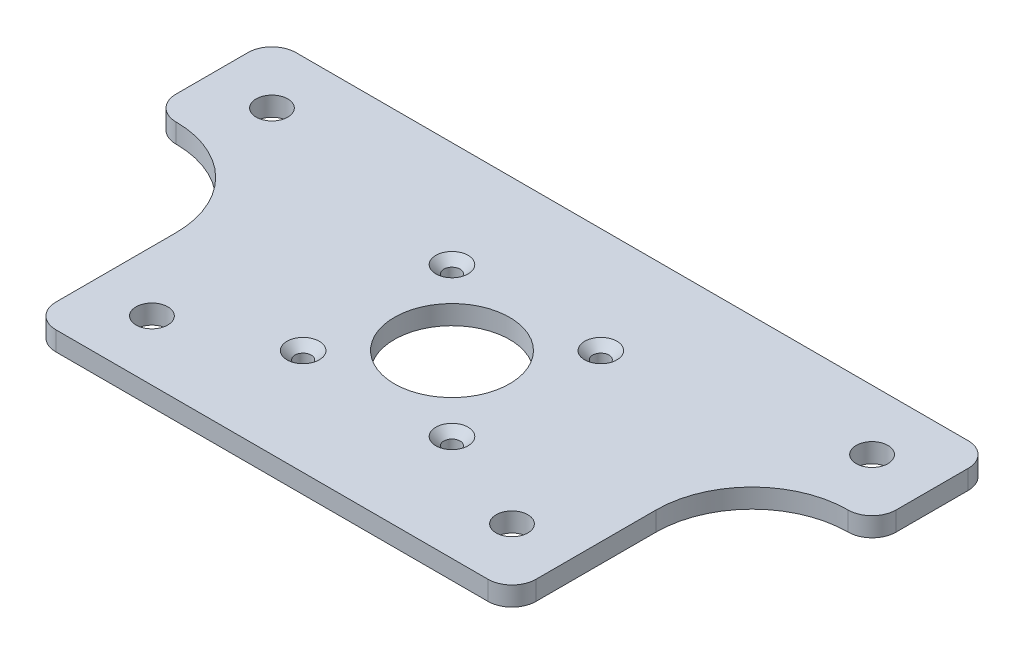
ISO-10303-21;
HEADER;
FILE_DESCRIPTION(('STEP AP214'),'2;1');
FILE_NAME('part.step','',(''),(''),'','','');
FILE_SCHEMA(('AUTOMOTIVE_DESIGN { 1 0 10303 214 1 1 1 1 }'));
ENDSEC;
DATA;
#1=APPLICATION_CONTEXT('core data for automotive mechanical design processes');
#2=APPLICATION_PROTOCOL_DEFINITION('international standard','automotive_design',2000,#1);
#3=PRODUCT_CONTEXT('',#1,'mechanical');
#4=PRODUCT('Part','Part','',(#3));
#5=PRODUCT_RELATED_PRODUCT_CATEGORY('part','',(#4));
#6=PRODUCT_DEFINITION_FORMATION('','',#4);
#7=PRODUCT_DEFINITION_CONTEXT('part definition',#1,'design');
#8=PRODUCT_DEFINITION('design','',#6,#7);
#9=PRODUCT_DEFINITION_SHAPE('','',#8);
#10=(LENGTH_UNIT() NAMED_UNIT(*) SI_UNIT(.MILLI.,.METRE.));
#11=(NAMED_UNIT(*) PLANE_ANGLE_UNIT() SI_UNIT($,.RADIAN.));
#12=(NAMED_UNIT(*) SI_UNIT($,.STERADIAN.) SOLID_ANGLE_UNIT());
#13=UNCERTAINTY_MEASURE_WITH_UNIT(LENGTH_MEASURE(1.E-05),#10,'distance_accuracy_value','');
#14=(GEOMETRIC_REPRESENTATION_CONTEXT(3) GLOBAL_UNCERTAINTY_ASSIGNED_CONTEXT((#13)) GLOBAL_UNIT_ASSIGNED_CONTEXT((#10,
#11,#12)) REPRESENTATION_CONTEXT('',''));
#15=CARTESIAN_POINT('',(0.,0.,0.));
#16=DIRECTION('',(0.,0.,1.));
#17=DIRECTION('',(1.,0.,0.));
#18=AXIS2_PLACEMENT_3D('',#15,#16,#17);
#19=CARTESIAN_POINT('',(0.,4.,-37.5));
#20=DIRECTION('',(0.,0.,1.));
#21=DIRECTION('',(1.,0.,0.));
#22=AXIS2_PLACEMENT_3D('',#19,#20,#21);
#23=PLANE('',#22);
#24=DIRECTION('',(-1.,0.,0.));
#25=VECTOR('',#24,1.);
#26=CARTESIAN_POINT('',(0.,4.,-37.5));
#27=LINE('',#26,#25);
#28=CARTESIAN_POINT('',(70.,4.,-37.5));
#29=VERTEX_POINT('',#28);
#30=CARTESIAN_POINT('',(-70.,4.,-37.5));
#31=VERTEX_POINT('',#30);
#32=EDGE_CURVE('E156',#29,#31,#27,.T.);
#33=ORIENTED_EDGE('',*,*,#32,.F.);
#34=DIRECTION('',(0.,-1.,0.));
#35=VECTOR('',#34,1.);
#36=CARTESIAN_POINT('',(70.,0.,-37.5));
#37=LINE('',#36,#35);
#38=CARTESIAN_POINT('',(70.,0.,-37.5));
#39=VERTEX_POINT('',#38);
#40=EDGE_CURVE('E141',#29,#39,#37,.T.);
#41=ORIENTED_EDGE('',*,*,#40,.T.);
#42=DIRECTION('',(-1.,0.,0.));
#43=VECTOR('',#42,1.);
#44=CARTESIAN_POINT('',(0.,0.,-37.5));
#45=LINE('',#44,#43);
#46=CARTESIAN_POINT('',(-70.,0.,-37.5));
#47=VERTEX_POINT('',#46);
#48=EDGE_CURVE('E153',#39,#47,#45,.T.);
#49=ORIENTED_EDGE('',*,*,#48,.T.);
#50=DIRECTION('',(0.,-1.,0.));
#51=VECTOR('',#50,1.);
#52=CARTESIAN_POINT('',(-70.,4.,-37.5));
#53=LINE('',#52,#51);
#54=EDGE_CURVE('E158',#47,#31,#53,.F.);
#55=ORIENTED_EDGE('',*,*,#54,.T.);
#56=EDGE_LOOP('',(#33,#41,#49,#55));
#57=FACE_BOUND('',#56,.T.);
#58=ADVANCED_FACE('F38',(#57),#23,.F.);
#59=CARTESIAN_POINT('',(-75.,4.,0.));
#60=DIRECTION('',(1.,0.,0.));
#61=DIRECTION('',(0.,0.,-1.));
#62=AXIS2_PLACEMENT_3D('',#59,#60,#61);
#63=PLANE('',#62);
#64=DIRECTION('',(0.,0.,1.));
#65=VECTOR('',#64,1.);
#66=CARTESIAN_POINT('',(-75.,0.,0.));
#67=LINE('',#66,#65);
#68=CARTESIAN_POINT('',(-75.,0.,-32.5));
#69=VERTEX_POINT('',#68);
#70=CARTESIAN_POINT('',(-75.,0.,-17.5));
#71=VERTEX_POINT('',#70);
#72=EDGE_CURVE('E163',#69,#71,#67,.T.);
#73=ORIENTED_EDGE('',*,*,#72,.T.);
#74=DIRECTION('',(0.,-1.,0.));
#75=VECTOR('',#74,1.);
#76=CARTESIAN_POINT('',(-75.,4.,-17.5));
#77=LINE('',#76,#75);
#78=CARTESIAN_POINT('',(-75.,4.,-17.5));
#79=VERTEX_POINT('',#78);
#80=EDGE_CURVE('E233',#71,#79,#77,.F.);
#81=ORIENTED_EDGE('',*,*,#80,.T.);
#82=DIRECTION('',(0.,0.,1.));
#83=VECTOR('',#82,1.);
#84=CARTESIAN_POINT('',(-75.,4.,0.));
#85=LINE('',#84,#83);
#86=CARTESIAN_POINT('',(-75.,4.,-32.5));
#87=VERTEX_POINT('',#86);
#88=EDGE_CURVE('E255',#87,#79,#85,.T.);
#89=ORIENTED_EDGE('',*,*,#88,.F.);
#90=DIRECTION('',(0.,-1.,0.));
#91=VECTOR('',#90,1.);
#92=CARTESIAN_POINT('',(-75.,4.,-32.5));
#93=LINE('',#92,#91);
#94=EDGE_CURVE('E230',#87,#69,#93,.T.);
#95=ORIENTED_EDGE('',*,*,#94,.T.);
#96=EDGE_LOOP('',(#73,#81,#89,#95));
#97=FACE_BOUND('',#96,.T.);
#98=ADVANCED_FACE('F293',(#97),#63,.F.);
#99=CARTESIAN_POINT('',(-50.,4.,0.));
#100=DIRECTION('',(1.,0.,0.));
#101=DIRECTION('',(0.,0.,-1.));
#102=AXIS2_PLACEMENT_3D('',#99,#100,#101);
#103=PLANE('',#102);
#104=DIRECTION('',(0.,0.,1.));
#105=VECTOR('',#104,1.);
#106=CARTESIAN_POINT('',(-50.,4.,0.));
#107=LINE('',#106,#105);
#108=CARTESIAN_POINT('',(-50.,4.,7.49999999999999));
#109=VERTEX_POINT('',#108);
#110=CARTESIAN_POINT('',(-50.,4.,32.5));
#111=VERTEX_POINT('',#110);
#112=EDGE_CURVE('E251',#109,#111,#107,.T.);
#113=ORIENTED_EDGE('',*,*,#112,.F.);
#114=DIRECTION('',(0.,-1.,0.));
#115=VECTOR('',#114,1.);
#116=CARTESIAN_POINT('',(-50.,4.,7.49999999999999));
#117=LINE('',#116,#115);
#118=CARTESIAN_POINT('',(-50.,0.,7.49999999999999));
#119=VERTEX_POINT('',#118);
#120=EDGE_CURVE('E237',#109,#119,#117,.T.);
#121=ORIENTED_EDGE('',*,*,#120,.T.);
#122=DIRECTION('',(0.,0.,1.));
#123=VECTOR('',#122,1.);
#124=CARTESIAN_POINT('',(-50.,0.,0.));
#125=LINE('',#124,#123);
#126=CARTESIAN_POINT('',(-50.,0.,32.5));
#127=VERTEX_POINT('',#126);
#128=EDGE_CURVE('E167',#119,#127,#125,.T.);
#129=ORIENTED_EDGE('',*,*,#128,.T.);
#130=DIRECTION('',(0.,-1.,0.));
#131=VECTOR('',#130,1.);
#132=CARTESIAN_POINT('',(-50.,4.,32.5));
#133=LINE('',#132,#131);
#134=EDGE_CURVE('E225',#127,#111,#133,.F.);
#135=ORIENTED_EDGE('',*,*,#134,.T.);
#136=EDGE_LOOP('',(#113,#121,#129,#135));
#137=FACE_BOUND('',#136,.T.);
#138=ADVANCED_FACE('F250',(#137),#103,.F.);
#139=CARTESIAN_POINT('',(0.,4.,37.5));
#140=DIRECTION('',(0.,0.,1.));
#141=DIRECTION('',(1.,0.,0.));
#142=AXIS2_PLACEMENT_3D('',#139,#140,#141);
#143=PLANE('',#142);
#144=DIRECTION('',(-1.,0.,0.));
#145=VECTOR('',#144,1.);
#146=CARTESIAN_POINT('',(0.,0.,37.5));
#147=LINE('',#146,#145);
#148=CARTESIAN_POINT('',(45.,0.,37.5));
#149=VERTEX_POINT('',#148);
#150=CARTESIAN_POINT('',(-45.,0.,37.5));
#151=VERTEX_POINT('',#150);
#152=EDGE_CURVE('E177',#149,#151,#147,.T.);
#153=ORIENTED_EDGE('',*,*,#152,.F.);
#154=DIRECTION('',(0.,-1.,0.));
#155=VECTOR('',#154,1.);
#156=CARTESIAN_POINT('',(45.,4.,37.5));
#157=LINE('',#156,#155);
#158=CARTESIAN_POINT('',(45.,4.,37.5));
#159=VERTEX_POINT('',#158);
#160=EDGE_CURVE('E223',#149,#159,#157,.F.);
#161=ORIENTED_EDGE('',*,*,#160,.T.);
#162=DIRECTION('',(-1.,0.,0.));
#163=VECTOR('',#162,1.);
#164=CARTESIAN_POINT('',(0.,4.,37.5));
#165=LINE('',#164,#163);
#166=CARTESIAN_POINT('',(-45.,4.,37.5));
#167=VERTEX_POINT('',#166);
#168=EDGE_CURVE('E254',#159,#167,#165,.T.);
#169=ORIENTED_EDGE('',*,*,#168,.T.);
#170=DIRECTION('',(0.,-1.,0.));
#171=VECTOR('',#170,1.);
#172=CARTESIAN_POINT('',(-45.,0.,37.5));
#173=LINE('',#172,#171);
#174=EDGE_CURVE('E220',#167,#151,#173,.T.);
#175=ORIENTED_EDGE('',*,*,#174,.T.);
#176=EDGE_LOOP('',(#153,#161,#169,#175));
#177=FACE_BOUND('',#176,.T.);
#178=ADVANCED_FACE('F341',(#177),#143,.T.);
#179=CARTESIAN_POINT('',(50.,4.,0.));
#180=DIRECTION('',(-1.,0.,0.));
#181=DIRECTION('',(0.,0.,1.));
#182=AXIS2_PLACEMENT_3D('',#179,#180,#181);
#183=PLANE('',#182);
#184=DIRECTION('',(0.,0.,-1.));
#185=VECTOR('',#184,1.);
#186=CARTESIAN_POINT('',(50.,0.,0.));
#187=LINE('',#186,#185);
#188=CARTESIAN_POINT('',(50.,0.,32.5));
#189=VERTEX_POINT('',#188);
#190=CARTESIAN_POINT('',(50.,0.,7.50000000000001));
#191=VERTEX_POINT('',#190);
#192=EDGE_CURVE('E180',#189,#191,#187,.T.);
#193=ORIENTED_EDGE('',*,*,#192,.T.);
#194=DIRECTION('',(0.,-1.,0.));
#195=VECTOR('',#194,1.);
#196=CARTESIAN_POINT('',(50.,4.,7.50000000000001));
#197=LINE('',#196,#195);
#198=CARTESIAN_POINT('',(50.,4.,7.50000000000001));
#199=VERTEX_POINT('',#198);
#200=EDGE_CURVE('E235',#191,#199,#197,.F.);
#201=ORIENTED_EDGE('',*,*,#200,.T.);
#202=DIRECTION('',(0.,0.,-1.));
#203=VECTOR('',#202,1.);
#204=CARTESIAN_POINT('',(50.,4.,0.));
#205=LINE('',#204,#203);
#206=CARTESIAN_POINT('',(50.,4.,32.5));
#207=VERTEX_POINT('',#206);
#208=EDGE_CURVE('E258',#207,#199,#205,.T.);
#209=ORIENTED_EDGE('',*,*,#208,.F.);
#210=DIRECTION('',(0.,-1.,0.));
#211=VECTOR('',#210,1.);
#212=CARTESIAN_POINT('',(50.,0.,32.5));
#213=LINE('',#212,#211);
#214=EDGE_CURVE('E217',#207,#189,#213,.T.);
#215=ORIENTED_EDGE('',*,*,#214,.T.);
#216=EDGE_LOOP('',(#193,#201,#209,#215));
#217=FACE_BOUND('',#216,.T.);
#218=ADVANCED_FACE('F335',(#217),#183,.F.);
#219=CARTESIAN_POINT('',(75.,4.,0.));
#220=DIRECTION('',(1.,0.,0.));
#221=DIRECTION('',(0.,0.,-1.));
#222=AXIS2_PLACEMENT_3D('',#219,#220,#221);
#223=PLANE('',#222);
#224=DIRECTION('',(0.,0.,1.));
#225=VECTOR('',#224,1.);
#226=CARTESIAN_POINT('',(75.,0.,0.));
#227=LINE('',#226,#225);
#228=CARTESIAN_POINT('',(75.,0.,-32.5));
#229=VERTEX_POINT('',#228);
#230=CARTESIAN_POINT('',(75.,0.,-17.5));
#231=VERTEX_POINT('',#230);
#232=EDGE_CURVE('E183',#229,#231,#227,.T.);
#233=ORIENTED_EDGE('',*,*,#232,.F.);
#234=DIRECTION('',(0.,-1.,0.));
#235=VECTOR('',#234,1.);
#236=CARTESIAN_POINT('',(75.,4.,-32.5));
#237=LINE('',#236,#235);
#238=CARTESIAN_POINT('',(75.,4.,-32.5));
#239=VERTEX_POINT('',#238);
#240=EDGE_CURVE('E142',#229,#239,#237,.F.);
#241=ORIENTED_EDGE('',*,*,#240,.T.);
#242=DIRECTION('',(0.,0.,1.));
#243=VECTOR('',#242,1.);
#244=CARTESIAN_POINT('',(75.,4.,0.));
#245=LINE('',#244,#243);
#246=CARTESIAN_POINT('',(75.,4.,-17.5));
#247=VERTEX_POINT('',#246);
#248=EDGE_CURVE('E265',#239,#247,#245,.T.);
#249=ORIENTED_EDGE('',*,*,#248,.T.);
#250=DIRECTION('',(0.,-1.,0.));
#251=VECTOR('',#250,1.);
#252=CARTESIAN_POINT('',(75.,0.,-17.5));
#253=LINE('',#252,#251);
#254=EDGE_CURVE('E147',#247,#231,#253,.T.);
#255=ORIENTED_EDGE('',*,*,#254,.T.);
#256=EDGE_LOOP('',(#233,#241,#249,#255));
#257=FACE_BOUND('',#256,.T.);
#258=ADVANCED_FACE('F287',(#257),#223,.T.);
#259=CARTESIAN_POINT('',(0.,4.,0.));
#260=DIRECTION('',(0.,-1.,0.));
#261=DIRECTION('',(0.,0.,-1.));
#262=AXIS2_PLACEMENT_3D('',#259,#260,#261);
#263=CYLINDRICAL_SURFACE('',#262,12.);
#264=CARTESIAN_POINT('',(0.,4.,0.));
#265=DIRECTION('',(0.,1.,0.));
#266=DIRECTION('',(0.,0.,1.));
#267=AXIS2_PLACEMENT_3D('',#264,#265,#266);
#268=CIRCLE('',#267,12.);
#269=CARTESIAN_POINT('',(0.,4.,12.));
#270=VERTEX_POINT('',#269);
#271=EDGE_CURVE('E173',#270,#270,#268,.T.);
#272=ORIENTED_EDGE('',*,*,#271,.T.);
#273=EDGE_LOOP('',(#272));
#274=FACE_BOUND('',#273,.T.);
#275=CARTESIAN_POINT('',(0.,0.,0.));
#276=DIRECTION('',(0.,1.,0.));
#277=DIRECTION('',(0.,0.,1.));
#278=AXIS2_PLACEMENT_3D('',#275,#276,#277);
#279=CIRCLE('',#278,12.);
#280=CARTESIAN_POINT('',(0.,0.,12.));
#281=VERTEX_POINT('',#280);
#282=EDGE_CURVE('E185',#281,#281,#279,.T.);
#283=ORIENTED_EDGE('',*,*,#282,.F.);
#284=EDGE_LOOP('',(#283));
#285=FACE_BOUND('',#284,.T.);
#286=ADVANCED_FACE('F273',(#274,#285),#263,.F.);
#287=CARTESIAN_POINT('',(0.,4.,0.));
#288=DIRECTION('',(0.,1.,0.));
#289=DIRECTION('',(0.,0.,1.));
#290=AXIS2_PLACEMENT_3D('',#287,#288,#289);
#291=PLANE('',#290);
#292=CARTESIAN_POINT('',(-62.5,4.,-25.));
#293=DIRECTION('',(0.,1.,0.));
#294=DIRECTION('',(0.,0.,1.));
#295=AXIS2_PLACEMENT_3D('',#292,#293,#294);
#296=CIRCLE('',#295,3.29999999999999);
#297=CARTESIAN_POINT('',(-62.5,4.,-21.7));
#298=VERTEX_POINT('',#297);
#299=EDGE_CURVE('E593',#298,#298,#296,.T.);
#300=ORIENTED_EDGE('',*,*,#299,.F.);
#301=EDGE_LOOP('',(#300));
#302=FACE_BOUND('',#301,.T.);
#303=CARTESIAN_POINT('',(-37.5,4.,25.));
#304=DIRECTION('',(0.,1.,0.));
#305=DIRECTION('',(0.,0.,1.));
#306=AXIS2_PLACEMENT_3D('',#303,#304,#305);
#307=CIRCLE('',#306,3.29999999999999);
#308=CARTESIAN_POINT('',(-37.5,4.,28.3));
#309=VERTEX_POINT('',#308);
#310=EDGE_CURVE('E597',#309,#309,#307,.T.);
#311=ORIENTED_EDGE('',*,*,#310,.F.);
#312=EDGE_LOOP('',(#311));
#313=FACE_BOUND('',#312,.T.);
#314=CARTESIAN_POINT('',(37.5,4.,25.));
#315=DIRECTION('',(0.,1.,0.));
#316=DIRECTION('',(0.,0.,1.));
#317=AXIS2_PLACEMENT_3D('',#314,#315,#316);
#318=CIRCLE('',#317,3.29999999999999);
#319=CARTESIAN_POINT('',(37.5,4.,28.3));
#320=VERTEX_POINT('',#319);
#321=EDGE_CURVE('E606',#320,#320,#318,.T.);
#322=ORIENTED_EDGE('',*,*,#321,.F.);
#323=EDGE_LOOP('',(#322));
#324=FACE_BOUND('',#323,.T.);
#325=CARTESIAN_POINT('',(62.5,4.,-25.));
#326=DIRECTION('',(0.,1.,0.));
#327=DIRECTION('',(0.,0.,1.));
#328=AXIS2_PLACEMENT_3D('',#325,#326,#327);
#329=CIRCLE('',#328,3.3);
#330=CARTESIAN_POINT('',(62.5,4.,-21.7));
#331=VERTEX_POINT('',#330);
#332=EDGE_CURVE('E612',#331,#331,#329,.T.);
#333=ORIENTED_EDGE('',*,*,#332,.F.);
#334=EDGE_LOOP('',(#333));
#335=FACE_BOUND('',#334,.T.);
#336=CARTESIAN_POINT('',(-15.5,4.,15.5));
#337=DIRECTION('',(0.,1.,0.));
#338=DIRECTION('',(0.,0.,1.));
#339=AXIS2_PLACEMENT_3D('',#336,#337,#338);
#340=CIRCLE('',#339,3.36);
#341=CARTESIAN_POINT('',(-15.5,4.,18.86));
#342=VERTEX_POINT('',#341);
#343=EDGE_CURVE('E615',#342,#342,#340,.T.);
#344=ORIENTED_EDGE('',*,*,#343,.F.);
#345=EDGE_LOOP('',(#344));
#346=FACE_BOUND('',#345,.T.);
#347=CARTESIAN_POINT('',(15.5,4.,15.5));
#348=DIRECTION('',(0.,1.,0.));
#349=DIRECTION('',(0.,0.,1.));
#350=AXIS2_PLACEMENT_3D('',#347,#348,#349);
#351=CIRCLE('',#350,3.36);
#352=CARTESIAN_POINT('',(15.5,4.,18.86));
#353=VERTEX_POINT('',#352);
#354=EDGE_CURVE('E624',#353,#353,#351,.T.);
#355=ORIENTED_EDGE('',*,*,#354,.F.);
#356=EDGE_LOOP('',(#355));
#357=FACE_BOUND('',#356,.T.);
#358=CARTESIAN_POINT('',(15.5,4.,-15.5));
#359=DIRECTION('',(0.,1.,0.));
#360=DIRECTION('',(0.,0.,1.));
#361=AXIS2_PLACEMENT_3D('',#358,#359,#360);
#362=CIRCLE('',#361,3.36);
#363=CARTESIAN_POINT('',(15.5,4.,-12.14));
#364=VERTEX_POINT('',#363);
#365=EDGE_CURVE('E633',#364,#364,#362,.T.);
#366=ORIENTED_EDGE('',*,*,#365,.F.);
#367=EDGE_LOOP('',(#366));
#368=FACE_BOUND('',#367,.T.);
#369=CARTESIAN_POINT('',(-15.5,4.,-15.5));
#370=DIRECTION('',(0.,1.,0.));
#371=DIRECTION('',(0.,0.,1.));
#372=AXIS2_PLACEMENT_3D('',#369,#370,#371);
#373=CIRCLE('',#372,3.36);
#374=CARTESIAN_POINT('',(-15.5,4.,-12.14));
#375=VERTEX_POINT('',#374);
#376=EDGE_CURVE('E642',#375,#375,#373,.T.);
#377=ORIENTED_EDGE('',*,*,#376,.F.);
#378=EDGE_LOOP('',(#377));
#379=FACE_BOUND('',#378,.T.);
#380=ORIENTED_EDGE('',*,*,#248,.F.);
#381=CARTESIAN_POINT('',(70.,4.,-32.5));
#382=DIRECTION('',(0.,1.,0.));
#383=DIRECTION('',(0.,0.,1.));
#384=AXIS2_PLACEMENT_3D('',#381,#382,#383);
#385=CIRCLE('',#384,5.);
#386=EDGE_CURVE('E212',#239,#29,#385,.T.);
#387=ORIENTED_EDGE('',*,*,#386,.T.);
#388=ORIENTED_EDGE('',*,*,#32,.T.);
#389=CARTESIAN_POINT('',(-70.,4.,-32.5));
#390=DIRECTION('',(0.,1.,0.));
#391=DIRECTION('',(0.,0.,1.));
#392=AXIS2_PLACEMENT_3D('',#389,#390,#391);
#393=CIRCLE('',#392,5.);
#394=EDGE_CURVE('E202',#31,#87,#393,.T.);
#395=ORIENTED_EDGE('',*,*,#394,.T.);
#396=ORIENTED_EDGE('',*,*,#88,.T.);
#397=CARTESIAN_POINT('',(-70.,4.,-17.5));
#398=DIRECTION('',(0.,1.,0.));
#399=DIRECTION('',(0.,0.,1.));
#400=AXIS2_PLACEMENT_3D('',#397,#398,#399);
#401=CIRCLE('',#400,5.);
#402=CARTESIAN_POINT('',(-70.,4.,-12.5));
#403=VERTEX_POINT('',#402);
#404=EDGE_CURVE('E204',#79,#403,#401,.T.);
#405=ORIENTED_EDGE('',*,*,#404,.T.);
#406=CARTESIAN_POINT('',(-70.,4.,7.49999999999999));
#407=DIRECTION('',(0.,1.,0.));
#408=DIRECTION('',(0.,0.,1.));
#409=AXIS2_PLACEMENT_3D('',#406,#407,#408);
#410=CIRCLE('',#409,20.);
#411=EDGE_CURVE('E11',#403,#109,#410,.F.);
#412=ORIENTED_EDGE('',*,*,#411,.T.);
#413=ORIENTED_EDGE('',*,*,#112,.T.);
#414=CARTESIAN_POINT('',(-45.,4.,32.5));
#415=DIRECTION('',(0.,1.,0.));
#416=DIRECTION('',(0.,0.,1.));
#417=AXIS2_PLACEMENT_3D('',#414,#415,#416);
#418=CIRCLE('',#417,5.);
#419=EDGE_CURVE('E206',#111,#167,#418,.T.);
#420=ORIENTED_EDGE('',*,*,#419,.T.);
#421=ORIENTED_EDGE('',*,*,#168,.F.);
#422=CARTESIAN_POINT('',(45.,4.,32.5));
#423=DIRECTION('',(0.,1.,0.));
#424=DIRECTION('',(0.,0.,1.));
#425=AXIS2_PLACEMENT_3D('',#422,#423,#424);
#426=CIRCLE('',#425,5.);
#427=EDGE_CURVE('E208',#159,#207,#426,.T.);
#428=ORIENTED_EDGE('',*,*,#427,.T.);
#429=ORIENTED_EDGE('',*,*,#208,.T.);
#430=CARTESIAN_POINT('',(70.,4.,7.50000000000001));
#431=DIRECTION('',(0.,1.,0.));
#432=DIRECTION('',(0.,0.,1.));
#433=AXIS2_PLACEMENT_3D('',#430,#431,#432);
#434=CIRCLE('',#433,20.);
#435=CARTESIAN_POINT('',(70.,4.,-12.5));
#436=VERTEX_POINT('',#435);
#437=EDGE_CURVE('E241',#199,#436,#434,.F.);
#438=ORIENTED_EDGE('',*,*,#437,.T.);
#439=CARTESIAN_POINT('',(70.,4.,-17.5));
#440=DIRECTION('',(0.,1.,0.));
#441=DIRECTION('',(0.,0.,1.));
#442=AXIS2_PLACEMENT_3D('',#439,#440,#441);
#443=CIRCLE('',#442,5.);
#444=EDGE_CURVE('E210',#436,#247,#443,.T.);
#445=ORIENTED_EDGE('',*,*,#444,.T.);
#446=EDGE_LOOP('',(#380,#387,#388,#395,#396,#405,#412,#413,#420,#421,#428,#429,#438,#445));
#447=FACE_BOUND('',#446,.T.);
#448=ORIENTED_EDGE('',*,*,#271,.F.);
#449=EDGE_LOOP('',(#448));
#450=FACE_BOUND('',#449,.T.);
#451=ADVANCED_FACE('F276',(#302,#313,#324,#335,#346,#357,#368,#379,#447,#450),#291,.T.);
#452=CARTESIAN_POINT('',(0.,0.,0.));
#453=DIRECTION('',(0.,1.,0.));
#454=DIRECTION('',(0.,0.,1.));
#455=AXIS2_PLACEMENT_3D('',#452,#453,#454);
#456=PLANE('',#455);
#457=CARTESIAN_POINT('',(-62.5,0.,-25.));
#458=DIRECTION('',(0.,-1.,0.));
#459=DIRECTION('',(0.,0.,-1.));
#460=AXIS2_PLACEMENT_3D('',#457,#458,#459);
#461=CIRCLE('',#460,3.29999999999998);
#462=CARTESIAN_POINT('',(-62.5,0.,-28.3));
#463=VERTEX_POINT('',#462);
#464=EDGE_CURVE('E591',#463,#463,#461,.T.);
#465=ORIENTED_EDGE('',*,*,#464,.F.);
#466=EDGE_LOOP('',(#465));
#467=FACE_BOUND('',#466,.T.);
#468=CARTESIAN_POINT('',(-37.5,0.,25.));
#469=DIRECTION('',(0.,-1.,0.));
#470=DIRECTION('',(0.,0.,-1.));
#471=AXIS2_PLACEMENT_3D('',#468,#469,#470);
#472=CIRCLE('',#471,3.29999999999998);
#473=CARTESIAN_POINT('',(-37.5,0.,21.7));
#474=VERTEX_POINT('',#473);
#475=EDGE_CURVE('E594',#474,#474,#472,.T.);
#476=ORIENTED_EDGE('',*,*,#475,.F.);
#477=EDGE_LOOP('',(#476));
#478=FACE_BOUND('',#477,.T.);
#479=CARTESIAN_POINT('',(37.5,0.,25.));
#480=DIRECTION('',(0.,-1.,0.));
#481=DIRECTION('',(0.,0.,-1.));
#482=AXIS2_PLACEMENT_3D('',#479,#480,#481);
#483=CIRCLE('',#482,3.29999999999998);
#484=CARTESIAN_POINT('',(37.5,0.,21.7));
#485=VERTEX_POINT('',#484);
#486=EDGE_CURVE('E603',#485,#485,#483,.T.);
#487=ORIENTED_EDGE('',*,*,#486,.F.);
#488=EDGE_LOOP('',(#487));
#489=FACE_BOUND('',#488,.T.);
#490=CARTESIAN_POINT('',(62.5,0.,-25.));
#491=DIRECTION('',(0.,-1.,0.));
#492=DIRECTION('',(0.,0.,-1.));
#493=AXIS2_PLACEMENT_3D('',#490,#491,#492);
#494=CIRCLE('',#493,3.29999999999999);
#495=CARTESIAN_POINT('',(62.5,0.,-28.3));
#496=VERTEX_POINT('',#495);
#497=EDGE_CURVE('E609',#496,#496,#494,.T.);
#498=ORIENTED_EDGE('',*,*,#497,.F.);
#499=EDGE_LOOP('',(#498));
#500=FACE_BOUND('',#499,.T.);
#501=CARTESIAN_POINT('',(-15.5,0.,15.5));
#502=DIRECTION('',(0.,1.,0.));
#503=DIRECTION('',(0.,0.,1.));
#504=AXIS2_PLACEMENT_3D('',#501,#502,#503);
#505=CIRCLE('',#504,1.7);
#506=CARTESIAN_POINT('',(-15.5,0.,17.2));
#507=VERTEX_POINT('',#506);
#508=EDGE_CURVE('E621',#507,#507,#505,.T.);
#509=ORIENTED_EDGE('',*,*,#508,.T.);
#510=EDGE_LOOP('',(#509));
#511=FACE_BOUND('',#510,.T.);
#512=CARTESIAN_POINT('',(15.5,0.,15.5));
#513=DIRECTION('',(0.,1.,0.));
#514=DIRECTION('',(0.,0.,1.));
#515=AXIS2_PLACEMENT_3D('',#512,#513,#514);
#516=CIRCLE('',#515,1.7);
#517=CARTESIAN_POINT('',(15.5,0.,17.2));
#518=VERTEX_POINT('',#517);
#519=EDGE_CURVE('E630',#518,#518,#516,.T.);
#520=ORIENTED_EDGE('',*,*,#519,.T.);
#521=EDGE_LOOP('',(#520));
#522=FACE_BOUND('',#521,.T.);
#523=CARTESIAN_POINT('',(15.5,0.,-15.5));
#524=DIRECTION('',(0.,1.,0.));
#525=DIRECTION('',(0.,0.,1.));
#526=AXIS2_PLACEMENT_3D('',#523,#524,#525);
#527=CIRCLE('',#526,1.7);
#528=CARTESIAN_POINT('',(15.5,0.,-13.8));
#529=VERTEX_POINT('',#528);
#530=EDGE_CURVE('E639',#529,#529,#527,.T.);
#531=ORIENTED_EDGE('',*,*,#530,.T.);
#532=EDGE_LOOP('',(#531));
#533=FACE_BOUND('',#532,.T.);
#534=CARTESIAN_POINT('',(-15.5,0.,-15.5));
#535=DIRECTION('',(0.,1.,0.));
#536=DIRECTION('',(0.,0.,1.));
#537=AXIS2_PLACEMENT_3D('',#534,#535,#536);
#538=CIRCLE('',#537,1.7);
#539=CARTESIAN_POINT('',(-15.5,0.,-13.8));
#540=VERTEX_POINT('',#539);
#541=EDGE_CURVE('E164',#540,#540,#538,.T.);
#542=ORIENTED_EDGE('',*,*,#541,.T.);
#543=EDGE_LOOP('',(#542));
#544=FACE_BOUND('',#543,.T.);
#545=ORIENTED_EDGE('',*,*,#48,.F.);
#546=CARTESIAN_POINT('',(70.,0.,-32.5));
#547=DIRECTION('',(0.,1.,0.));
#548=DIRECTION('',(0.,0.,1.));
#549=AXIS2_PLACEMENT_3D('',#546,#547,#548);
#550=CIRCLE('',#549,5.);
#551=EDGE_CURVE('E137',#39,#229,#550,.F.);
#552=ORIENTED_EDGE('',*,*,#551,.T.);
#553=ORIENTED_EDGE('',*,*,#232,.T.);
#554=CARTESIAN_POINT('',(70.,0.,-17.5));
#555=DIRECTION('',(0.,1.,0.));
#556=DIRECTION('',(0.,0.,1.));
#557=AXIS2_PLACEMENT_3D('',#554,#555,#556);
#558=CIRCLE('',#557,5.);
#559=CARTESIAN_POINT('',(70.,0.,-12.5));
#560=VERTEX_POINT('',#559);
#561=EDGE_CURVE('E148',#231,#560,#558,.F.);
#562=ORIENTED_EDGE('',*,*,#561,.T.);
#563=CARTESIAN_POINT('',(70.,0.,7.50000000000001));
#564=DIRECTION('',(0.,1.,0.));
#565=DIRECTION('',(0.,0.,1.));
#566=AXIS2_PLACEMENT_3D('',#563,#564,#565);
#567=CIRCLE('',#566,20.);
#568=EDGE_CURVE('E239',#560,#191,#567,.T.);
#569=ORIENTED_EDGE('',*,*,#568,.T.);
#570=ORIENTED_EDGE('',*,*,#192,.F.);
#571=CARTESIAN_POINT('',(45.,0.,32.5));
#572=DIRECTION('',(0.,1.,0.));
#573=DIRECTION('',(0.,0.,1.));
#574=AXIS2_PLACEMENT_3D('',#571,#572,#573);
#575=CIRCLE('',#574,5.);
#576=EDGE_CURVE('E195',#189,#149,#575,.F.);
#577=ORIENTED_EDGE('',*,*,#576,.T.);
#578=ORIENTED_EDGE('',*,*,#152,.T.);
#579=CARTESIAN_POINT('',(-45.,0.,32.5));
#580=DIRECTION('',(0.,1.,0.));
#581=DIRECTION('',(0.,0.,1.));
#582=AXIS2_PLACEMENT_3D('',#579,#580,#581);
#583=CIRCLE('',#582,5.);
#584=EDGE_CURVE('E192',#151,#127,#583,.F.);
#585=ORIENTED_EDGE('',*,*,#584,.T.);
#586=ORIENTED_EDGE('',*,*,#128,.F.);
#587=CARTESIAN_POINT('',(-70.,0.,7.49999999999999));
#588=DIRECTION('',(0.,1.,0.));
#589=DIRECTION('',(0.,0.,1.));
#590=AXIS2_PLACEMENT_3D('',#587,#588,#589);
#591=CIRCLE('',#590,20.);
#592=CARTESIAN_POINT('',(-70.,0.,-12.5));
#593=VERTEX_POINT('',#592);
#594=EDGE_CURVE('E46',#119,#593,#591,.T.);
#595=ORIENTED_EDGE('',*,*,#594,.T.);
#596=CARTESIAN_POINT('',(-70.,0.,-17.5));
#597=DIRECTION('',(0.,1.,0.));
#598=DIRECTION('',(0.,0.,1.));
#599=AXIS2_PLACEMENT_3D('',#596,#597,#598);
#600=CIRCLE('',#599,5.);
#601=EDGE_CURVE('E190',#593,#71,#600,.F.);
#602=ORIENTED_EDGE('',*,*,#601,.T.);
#603=ORIENTED_EDGE('',*,*,#72,.F.);
#604=CARTESIAN_POINT('',(-70.,0.,-32.5));
#605=DIRECTION('',(0.,1.,0.));
#606=DIRECTION('',(0.,0.,1.));
#607=AXIS2_PLACEMENT_3D('',#604,#605,#606);
#608=CIRCLE('',#607,5.);
#609=EDGE_CURVE('E157',#69,#47,#608,.F.);
#610=ORIENTED_EDGE('',*,*,#609,.T.);
#611=EDGE_LOOP('',(#545,#552,#553,#562,#569,#570,#577,#578,#585,#586,#595,#602,#603,#610));
#612=FACE_BOUND('',#611,.T.);
#613=ORIENTED_EDGE('',*,*,#282,.T.);
#614=EDGE_LOOP('',(#613));
#615=FACE_BOUND('',#614,.T.);
#616=ADVANCED_FACE('F160',(#467,#478,#489,#500,#511,#522,#533,#544,#612,#615),#456,.F.);
#617=CARTESIAN_POINT('',(-15.5,4.,-15.5));
#618=DIRECTION('',(0.,1.,0.));
#619=DIRECTION('',(0.,0.,1.));
#620=AXIS2_PLACEMENT_3D('',#617,#618,#619);
#621=CYLINDRICAL_SURFACE('',#620,1.7);
#622=ORIENTED_EDGE('',*,*,#541,.F.);
#623=EDGE_LOOP('',(#622));
#624=FACE_BOUND('',#623,.T.);
#625=CARTESIAN_POINT('',(-15.5,2.34,-15.5));
#626=DIRECTION('',(0.,1.,0.));
#627=DIRECTION('',(0.,0.,1.));
#628=AXIS2_PLACEMENT_3D('',#625,#626,#627);
#629=CIRCLE('',#628,1.7);
#630=CARTESIAN_POINT('',(-15.5,2.34,-13.8));
#631=VERTEX_POINT('',#630);
#632=EDGE_CURVE('E170',#631,#631,#629,.T.);
#633=ORIENTED_EDGE('',*,*,#632,.T.);
#634=EDGE_LOOP('',(#633));
#635=FACE_BOUND('',#634,.T.);
#636=ADVANCED_FACE('F284',(#624,#635),#621,.F.);
#637=CARTESIAN_POINT('',(-15.5,4.,-15.5));
#638=DIRECTION('',(0.,1.,0.));
#639=DIRECTION('',(0.,0.,1.));
#640=AXIS2_PLACEMENT_3D('',#637,#638,#639);
#641=CONICAL_SURFACE('',#640,3.36,0.785398163397448);
#642=ORIENTED_EDGE('',*,*,#632,.F.);
#643=EDGE_LOOP('',(#642));
#644=FACE_BOUND('',#643,.T.);
#645=ORIENTED_EDGE('',*,*,#376,.T.);
#646=EDGE_LOOP('',(#645));
#647=FACE_BOUND('',#646,.T.);
#648=ADVANCED_FACE('F372',(#644,#647),#641,.F.);
#649=CARTESIAN_POINT('',(15.5,4.,-15.5));
#650=DIRECTION('',(0.,1.,0.));
#651=DIRECTION('',(0.,0.,1.));
#652=AXIS2_PLACEMENT_3D('',#649,#650,#651);
#653=CYLINDRICAL_SURFACE('',#652,1.7);
#654=ORIENTED_EDGE('',*,*,#530,.F.);
#655=EDGE_LOOP('',(#654));
#656=FACE_BOUND('',#655,.T.);
#657=CARTESIAN_POINT('',(15.5,2.34,-15.5));
#658=DIRECTION('',(0.,1.,0.));
#659=DIRECTION('',(0.,0.,1.));
#660=AXIS2_PLACEMENT_3D('',#657,#658,#659);
#661=CIRCLE('',#660,1.7);
#662=CARTESIAN_POINT('',(15.5,2.34,-13.8));
#663=VERTEX_POINT('',#662);
#664=EDGE_CURVE('E636',#663,#663,#661,.T.);
#665=ORIENTED_EDGE('',*,*,#664,.T.);
#666=EDGE_LOOP('',(#665));
#667=FACE_BOUND('',#666,.T.);
#668=ADVANCED_FACE('F382',(#656,#667),#653,.F.);
#669=CARTESIAN_POINT('',(15.5,4.,-15.5));
#670=DIRECTION('',(0.,1.,0.));
#671=DIRECTION('',(0.,0.,1.));
#672=AXIS2_PLACEMENT_3D('',#669,#670,#671);
#673=CONICAL_SURFACE('',#672,3.36,0.785398163397448);
#674=ORIENTED_EDGE('',*,*,#664,.F.);
#675=EDGE_LOOP('',(#674));
#676=FACE_BOUND('',#675,.T.);
#677=ORIENTED_EDGE('',*,*,#365,.T.);
#678=EDGE_LOOP('',(#677));
#679=FACE_BOUND('',#678,.T.);
#680=ADVANCED_FACE('F392',(#676,#679),#673,.F.);
#681=CARTESIAN_POINT('',(15.5,4.,15.5));
#682=DIRECTION('',(0.,1.,0.));
#683=DIRECTION('',(0.,0.,1.));
#684=AXIS2_PLACEMENT_3D('',#681,#682,#683);
#685=CYLINDRICAL_SURFACE('',#684,1.7);
#686=ORIENTED_EDGE('',*,*,#519,.F.);
#687=EDGE_LOOP('',(#686));
#688=FACE_BOUND('',#687,.T.);
#689=CARTESIAN_POINT('',(15.5,2.34,15.5));
#690=DIRECTION('',(0.,1.,0.));
#691=DIRECTION('',(0.,0.,1.));
#692=AXIS2_PLACEMENT_3D('',#689,#690,#691);
#693=CIRCLE('',#692,1.7);
#694=CARTESIAN_POINT('',(15.5,2.34,17.2));
#695=VERTEX_POINT('',#694);
#696=EDGE_CURVE('E627',#695,#695,#693,.T.);
#697=ORIENTED_EDGE('',*,*,#696,.T.);
#698=EDGE_LOOP('',(#697));
#699=FACE_BOUND('',#698,.T.);
#700=ADVANCED_FACE('F402',(#688,#699),#685,.F.);
#701=CARTESIAN_POINT('',(15.5,4.,15.5));
#702=DIRECTION('',(0.,1.,0.));
#703=DIRECTION('',(0.,0.,1.));
#704=AXIS2_PLACEMENT_3D('',#701,#702,#703);
#705=CONICAL_SURFACE('',#704,3.36,0.785398163397448);
#706=ORIENTED_EDGE('',*,*,#696,.F.);
#707=EDGE_LOOP('',(#706));
#708=FACE_BOUND('',#707,.T.);
#709=ORIENTED_EDGE('',*,*,#354,.T.);
#710=EDGE_LOOP('',(#709));
#711=FACE_BOUND('',#710,.T.);
#712=ADVANCED_FACE('F412',(#708,#711),#705,.F.);
#713=CARTESIAN_POINT('',(-15.5,4.,15.5));
#714=DIRECTION('',(0.,1.,0.));
#715=DIRECTION('',(0.,0.,1.));
#716=AXIS2_PLACEMENT_3D('',#713,#714,#715);
#717=CYLINDRICAL_SURFACE('',#716,1.7);
#718=ORIENTED_EDGE('',*,*,#508,.F.);
#719=EDGE_LOOP('',(#718));
#720=FACE_BOUND('',#719,.T.);
#721=CARTESIAN_POINT('',(-15.5,2.34,15.5));
#722=DIRECTION('',(0.,1.,0.));
#723=DIRECTION('',(0.,0.,1.));
#724=AXIS2_PLACEMENT_3D('',#721,#722,#723);
#725=CIRCLE('',#724,1.7);
#726=CARTESIAN_POINT('',(-15.5,2.34,17.2));
#727=VERTEX_POINT('',#726);
#728=EDGE_CURVE('E618',#727,#727,#725,.T.);
#729=ORIENTED_EDGE('',*,*,#728,.T.);
#730=EDGE_LOOP('',(#729));
#731=FACE_BOUND('',#730,.T.);
#732=ADVANCED_FACE('F422',(#720,#731),#717,.F.);
#733=CARTESIAN_POINT('',(-15.5,4.,15.5));
#734=DIRECTION('',(0.,1.,0.));
#735=DIRECTION('',(0.,0.,1.));
#736=AXIS2_PLACEMENT_3D('',#733,#734,#735);
#737=CONICAL_SURFACE('',#736,3.36,0.785398163397448);
#738=ORIENTED_EDGE('',*,*,#728,.F.);
#739=EDGE_LOOP('',(#738));
#740=FACE_BOUND('',#739,.T.);
#741=ORIENTED_EDGE('',*,*,#343,.T.);
#742=EDGE_LOOP('',(#741));
#743=FACE_BOUND('',#742,.T.);
#744=ADVANCED_FACE('F432',(#740,#743),#737,.F.);
#745=CARTESIAN_POINT('',(62.5,0.,-25.));
#746=DIRECTION('',(0.,-1.,0.));
#747=DIRECTION('',(0.,0.,-1.));
#748=AXIS2_PLACEMENT_3D('',#745,#746,#747);
#749=CYLINDRICAL_SURFACE('',#748,3.3);
#750=ORIENTED_EDGE('',*,*,#497,.T.);
#751=EDGE_LOOP('',(#750));
#752=FACE_BOUND('',#751,.T.);
#753=ORIENTED_EDGE('',*,*,#332,.T.);
#754=EDGE_LOOP('',(#753));
#755=FACE_BOUND('',#754,.T.);
#756=ADVANCED_FACE('F442',(#752,#755),#749,.F.);
#757=CARTESIAN_POINT('',(37.5,0.,25.));
#758=DIRECTION('',(0.,-1.,0.));
#759=DIRECTION('',(0.,0.,-1.));
#760=AXIS2_PLACEMENT_3D('',#757,#758,#759);
#761=CYLINDRICAL_SURFACE('',#760,3.29999999999999);
#762=ORIENTED_EDGE('',*,*,#486,.T.);
#763=EDGE_LOOP('',(#762));
#764=FACE_BOUND('',#763,.T.);
#765=ORIENTED_EDGE('',*,*,#321,.T.);
#766=EDGE_LOOP('',(#765));
#767=FACE_BOUND('',#766,.T.);
#768=ADVANCED_FACE('F452',(#764,#767),#761,.F.);
#769=CARTESIAN_POINT('',(-37.5,0.,25.));
#770=DIRECTION('',(0.,-1.,0.));
#771=DIRECTION('',(0.,0.,-1.));
#772=AXIS2_PLACEMENT_3D('',#769,#770,#771);
#773=CYLINDRICAL_SURFACE('',#772,3.29999999999999);
#774=ORIENTED_EDGE('',*,*,#475,.T.);
#775=EDGE_LOOP('',(#774));
#776=FACE_BOUND('',#775,.T.);
#777=ORIENTED_EDGE('',*,*,#310,.T.);
#778=EDGE_LOOP('',(#777));
#779=FACE_BOUND('',#778,.T.);
#780=ADVANCED_FACE('F462',(#776,#779),#773,.F.);
#781=CARTESIAN_POINT('',(-62.5,0.,-25.));
#782=DIRECTION('',(0.,-1.,0.));
#783=DIRECTION('',(0.,0.,-1.));
#784=AXIS2_PLACEMENT_3D('',#781,#782,#783);
#785=CYLINDRICAL_SURFACE('',#784,3.29999999999999);
#786=ORIENTED_EDGE('',*,*,#464,.T.);
#787=EDGE_LOOP('',(#786));
#788=FACE_BOUND('',#787,.T.);
#789=ORIENTED_EDGE('',*,*,#299,.T.);
#790=EDGE_LOOP('',(#789));
#791=FACE_BOUND('',#790,.T.);
#792=ADVANCED_FACE('F305',(#788,#791),#785,.F.);
#793=CARTESIAN_POINT('',(70.,4.,-32.5));
#794=DIRECTION('',(0.,1.,0.));
#795=DIRECTION('',(0.,0.,1.));
#796=AXIS2_PLACEMENT_3D('',#793,#794,#795);
#797=CYLINDRICAL_SURFACE('',#796,5.);
#798=ORIENTED_EDGE('',*,*,#386,.F.);
#799=ORIENTED_EDGE('',*,*,#240,.F.);
#800=ORIENTED_EDGE('',*,*,#551,.F.);
#801=ORIENTED_EDGE('',*,*,#40,.F.);
#802=EDGE_LOOP('',(#798,#799,#800,#801));
#803=FACE_BOUND('',#802,.T.);
#804=ADVANCED_FACE('F140',(#803),#797,.T.);
#805=CARTESIAN_POINT('',(70.,4.,-17.5));
#806=DIRECTION('',(0.,1.,0.));
#807=DIRECTION('',(0.,0.,1.));
#808=AXIS2_PLACEMENT_3D('',#805,#806,#807);
#809=CYLINDRICAL_SURFACE('',#808,5.);
#810=ORIENTED_EDGE('',*,*,#444,.F.);
#811=DIRECTION('',(0.,-1.,0.));
#812=VECTOR('',#811,1.);
#813=CARTESIAN_POINT('',(70.,4.,-12.5));
#814=LINE('',#813,#812);
#815=EDGE_CURVE('E214',#560,#436,#814,.F.);
#816=ORIENTED_EDGE('',*,*,#815,.F.);
#817=ORIENTED_EDGE('',*,*,#561,.F.);
#818=ORIENTED_EDGE('',*,*,#254,.F.);
#819=EDGE_LOOP('',(#810,#816,#817,#818));
#820=FACE_BOUND('',#819,.T.);
#821=ADVANCED_FACE('F304',(#820),#809,.T.);
#822=CARTESIAN_POINT('',(45.,4.,32.5));
#823=DIRECTION('',(0.,1.,0.));
#824=DIRECTION('',(0.,0.,1.));
#825=AXIS2_PLACEMENT_3D('',#822,#823,#824);
#826=CYLINDRICAL_SURFACE('',#825,5.);
#827=ORIENTED_EDGE('',*,*,#427,.F.);
#828=ORIENTED_EDGE('',*,*,#160,.F.);
#829=ORIENTED_EDGE('',*,*,#576,.F.);
#830=ORIENTED_EDGE('',*,*,#214,.F.);
#831=EDGE_LOOP('',(#827,#828,#829,#830));
#832=FACE_BOUND('',#831,.T.);
#833=ADVANCED_FACE('F308',(#832),#826,.T.);
#834=CARTESIAN_POINT('',(-45.,4.,32.5));
#835=DIRECTION('',(0.,1.,0.));
#836=DIRECTION('',(0.,0.,1.));
#837=AXIS2_PLACEMENT_3D('',#834,#835,#836);
#838=CYLINDRICAL_SURFACE('',#837,5.);
#839=ORIENTED_EDGE('',*,*,#419,.F.);
#840=ORIENTED_EDGE('',*,*,#134,.F.);
#841=ORIENTED_EDGE('',*,*,#584,.F.);
#842=ORIENTED_EDGE('',*,*,#174,.F.);
#843=EDGE_LOOP('',(#839,#840,#841,#842));
#844=FACE_BOUND('',#843,.T.);
#845=ADVANCED_FACE('F312',(#844),#838,.T.);
#846=CARTESIAN_POINT('',(-70.,4.,-17.5));
#847=DIRECTION('',(0.,1.,0.));
#848=DIRECTION('',(0.,0.,1.));
#849=AXIS2_PLACEMENT_3D('',#846,#847,#848);
#850=CYLINDRICAL_SURFACE('',#849,5.);
#851=ORIENTED_EDGE('',*,*,#404,.F.);
#852=ORIENTED_EDGE('',*,*,#80,.F.);
#853=ORIENTED_EDGE('',*,*,#601,.F.);
#854=DIRECTION('',(0.,-1.,0.));
#855=VECTOR('',#854,1.);
#856=CARTESIAN_POINT('',(-70.,0.,-12.5));
#857=LINE('',#856,#855);
#858=EDGE_CURVE('E228',#403,#593,#857,.T.);
#859=ORIENTED_EDGE('',*,*,#858,.F.);
#860=EDGE_LOOP('',(#851,#852,#853,#859));
#861=FACE_BOUND('',#860,.T.);
#862=ADVANCED_FACE('F248',(#861),#850,.T.);
#863=CARTESIAN_POINT('',(-70.,4.,-32.5));
#864=DIRECTION('',(0.,-1.,0.));
#865=DIRECTION('',(0.,0.,-1.));
#866=AXIS2_PLACEMENT_3D('',#863,#864,#865);
#867=CYLINDRICAL_SURFACE('',#866,5.);
#868=ORIENTED_EDGE('',*,*,#394,.F.);
#869=ORIENTED_EDGE('',*,*,#54,.F.);
#870=ORIENTED_EDGE('',*,*,#609,.F.);
#871=ORIENTED_EDGE('',*,*,#94,.F.);
#872=EDGE_LOOP('',(#868,#869,#870,#871));
#873=FACE_BOUND('',#872,.T.);
#874=ADVANCED_FACE('F319',(#873),#867,.T.);
#875=CARTESIAN_POINT('',(70.,4.,7.50000000000001));
#876=DIRECTION('',(0.,1.,0.));
#877=DIRECTION('',(0.,0.,1.));
#878=AXIS2_PLACEMENT_3D('',#875,#876,#877);
#879=CYLINDRICAL_SURFACE('',#878,20.);
#880=ORIENTED_EDGE('',*,*,#437,.F.);
#881=ORIENTED_EDGE('',*,*,#200,.F.);
#882=ORIENTED_EDGE('',*,*,#568,.F.);
#883=ORIENTED_EDGE('',*,*,#815,.T.);
#884=EDGE_LOOP('',(#880,#881,#882,#883));
#885=FACE_BOUND('',#884,.T.);
#886=ADVANCED_FACE('F321',(#885),#879,.F.);
#887=CARTESIAN_POINT('',(-70.,4.,7.49999999999999));
#888=DIRECTION('',(0.,-1.,0.));
#889=DIRECTION('',(0.,0.,-1.));
#890=AXIS2_PLACEMENT_3D('',#887,#888,#889);
#891=CYLINDRICAL_SURFACE('',#890,20.);
#892=ORIENTED_EDGE('',*,*,#411,.F.);
#893=ORIENTED_EDGE('',*,*,#858,.T.);
#894=ORIENTED_EDGE('',*,*,#594,.F.);
#895=ORIENTED_EDGE('',*,*,#120,.F.);
#896=EDGE_LOOP('',(#892,#893,#894,#895));
#897=FACE_BOUND('',#896,.T.);
#898=ADVANCED_FACE('F40',(#897),#891,.F.);
#899=CLOSED_SHELL('',(#58,#98,#138,#178,#218,#258,#286,#451,#616,#636,#648,#668,#680,#700,#712,
#732,#744,#756,#768,#780,#792,#804,#821,#833,#845,#862,#874,#886,#898));
#900=MANIFOLD_SOLID_BREP('B2',#899);
#901=ADVANCED_BREP_SHAPE_REPRESENTATION('',(#18,#900),#14);
#902=SHAPE_DEFINITION_REPRESENTATION(#9,#901);
ENDSEC;
END-ISO-10303-21;
